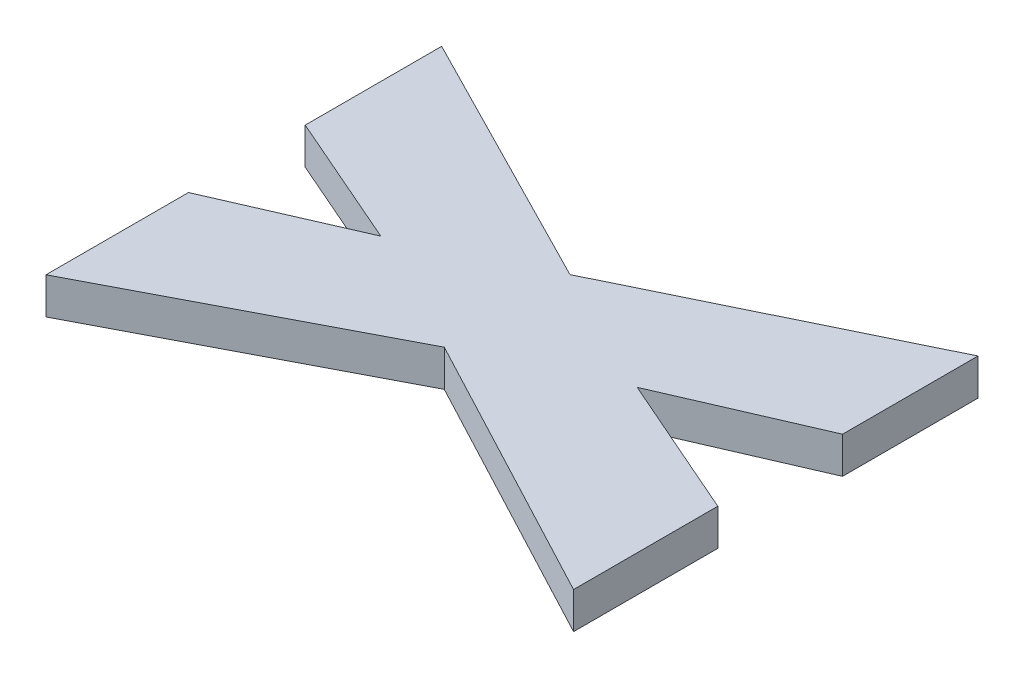
ISO-10303-21;
HEADER;
FILE_DESCRIPTION(('STEP AP214'),'2;1');
FILE_NAME('part.step','',(''),(''),'','','');
FILE_SCHEMA(('AUTOMOTIVE_DESIGN { 1 0 10303 214 1 1 1 1 }'));
ENDSEC;
DATA;
#1=APPLICATION_CONTEXT('core data for automotive mechanical design processes');
#2=APPLICATION_PROTOCOL_DEFINITION('international standard','automotive_design',2000,#1);
#3=PRODUCT_CONTEXT('',#1,'mechanical');
#4=PRODUCT('Part','Part','',(#3));
#5=PRODUCT_RELATED_PRODUCT_CATEGORY('part','',(#4));
#6=PRODUCT_DEFINITION_FORMATION('','',#4);
#7=PRODUCT_DEFINITION_CONTEXT('part definition',#1,'design');
#8=PRODUCT_DEFINITION('design','',#6,#7);
#9=PRODUCT_DEFINITION_SHAPE('','',#8);
#10=(LENGTH_UNIT() NAMED_UNIT(*) SI_UNIT(.MILLI.,.METRE.));
#11=(NAMED_UNIT(*) PLANE_ANGLE_UNIT() SI_UNIT($,.RADIAN.));
#12=(NAMED_UNIT(*) SI_UNIT($,.STERADIAN.) SOLID_ANGLE_UNIT());
#13=UNCERTAINTY_MEASURE_WITH_UNIT(LENGTH_MEASURE(1.E-05),#10,'distance_accuracy_value','');
#14=(GEOMETRIC_REPRESENTATION_CONTEXT(3) GLOBAL_UNCERTAINTY_ASSIGNED_CONTEXT((#13)) GLOBAL_UNIT_ASSIGNED_CONTEXT((#10,
#11,#12)) REPRESENTATION_CONTEXT('',''));
#15=CARTESIAN_POINT('',(0.,0.,0.));
#16=DIRECTION('',(0.,0.,1.));
#17=DIRECTION('',(1.,0.,0.));
#18=AXIS2_PLACEMENT_3D('',#15,#16,#17);
#19=CARTESIAN_POINT('',(2.3542541336,2.9906,-0.427267826055641));
#20=DIRECTION('',(1.,0.,0.));
#21=DIRECTION('',(0.,-1.,0.));
#22=AXIS2_PLACEMENT_3D('',#19,#20,#21);
#23=PLANE('',#22);
#24=DIRECTION('',(0.,0.,1.));
#25=VECTOR('',#24,1.);
#26=CARTESIAN_POINT('',(2.3542541336,2.9306,-0.427267826055641));
#27=LINE('',#26,#25);
#28=CARTESIAN_POINT('',(2.3542541336,2.9306,-0.427267826055641));
#29=VERTEX_POINT('',#28);
#30=CARTESIAN_POINT('',(2.3542541336,2.9306,-0.190288659388974));
#31=VERTEX_POINT('',#30);
#32=EDGE_CURVE('E11',#29,#31,#27,.T.);
#33=ORIENTED_EDGE('',*,*,#32,.F.);
#34=DIRECTION('',(0.,-1.,0.));
#35=VECTOR('',#34,1.);
#36=CARTESIAN_POINT('',(2.3542541336,2.9906,-0.427267826055641));
#37=LINE('',#36,#35);
#38=CARTESIAN_POINT('',(2.3542541336,2.9906,-0.427267826055641));
#39=VERTEX_POINT('',#38);
#40=EDGE_CURVE('E24',#39,#29,#37,.T.);
#41=ORIENTED_EDGE('',*,*,#40,.F.);
#42=DIRECTION('',(0.,0.,1.));
#43=VECTOR('',#42,1.);
#44=CARTESIAN_POINT('',(2.3542541336,2.9906,-0.427267826055641));
#45=LINE('',#44,#43);
#46=CARTESIAN_POINT('',(2.3542541336,2.9906,-0.190288659388974));
#47=VERTEX_POINT('',#46);
#48=EDGE_CURVE('E209',#39,#47,#45,.T.);
#49=ORIENTED_EDGE('',*,*,#48,.T.);
#50=DIRECTION('',(0.,-1.,0.));
#51=VECTOR('',#50,1.);
#52=CARTESIAN_POINT('',(2.3542541336,2.9906,-0.190288659388974));
#53=LINE('',#52,#51);
#54=EDGE_CURVE('E126',#47,#31,#53,.T.);
#55=ORIENTED_EDGE('',*,*,#54,.T.);
#56=EDGE_LOOP('',(#33,#41,#49,#55));
#57=FACE_BOUND('',#56,.T.);
#58=ADVANCED_FACE('F17',(#57),#23,.T.);
#59=CARTESIAN_POINT('',(2.1188548280444,2.9906,-0.530184492722307));
#60=DIRECTION('',(0.400588399484822,0.,-0.91625811548831));
#61=DIRECTION('',(-0.91625811548831,0.,-0.400588399484822));
#62=AXIS2_PLACEMENT_3D('',#59,#60,#61);
#63=PLANE('',#62);
#64=DIRECTION('',(0.91625811548831,0.,0.400588399484822));
#65=VECTOR('',#64,1.);
#66=CARTESIAN_POINT('',(2.1188548280444,2.9306,-0.530184492722307));
#67=LINE('',#66,#65);
#68=CARTESIAN_POINT('',(2.1188548280444,2.9306,-0.530184492722307));
#69=VERTEX_POINT('',#68);
#70=EDGE_CURVE('E206',#69,#29,#67,.T.);
#71=ORIENTED_EDGE('',*,*,#70,.F.);
#72=DIRECTION('',(0.,-1.,0.));
#73=VECTOR('',#72,1.);
#74=CARTESIAN_POINT('',(2.1188548280444,2.9906,-0.530184492722307));
#75=LINE('',#74,#73);
#76=CARTESIAN_POINT('',(2.1188548280444,2.9906,-0.530184492722307));
#77=VERTEX_POINT('',#76);
#78=EDGE_CURVE('E203',#77,#69,#75,.T.);
#79=ORIENTED_EDGE('',*,*,#78,.F.);
#80=DIRECTION('',(0.91625811548831,0.,0.400588399484822));
#81=VECTOR('',#80,1.);
#82=CARTESIAN_POINT('',(2.1188548280444,2.9906,-0.530184492722307));
#83=LINE('',#82,#81);
#84=EDGE_CURVE('E200',#77,#39,#83,.T.);
#85=ORIENTED_EDGE('',*,*,#84,.T.);
#86=ORIENTED_EDGE('',*,*,#40,.T.);
#87=EDGE_LOOP('',(#71,#79,#85,#86));
#88=FACE_BOUND('',#87,.T.);
#89=ADVANCED_FACE('F211',(#88),#63,.T.);
#90=CARTESIAN_POINT('',(2.3542541336,2.9906,-0.632198381611196));
#91=DIRECTION('',(0.397632125528502,0.,0.917544926827938));
#92=DIRECTION('',(0.917544926827938,0.,-0.397632125528502));
#93=AXIS2_PLACEMENT_3D('',#90,#91,#92);
#94=PLANE('',#93);
#95=DIRECTION('',(-0.917544926827938,0.,0.397632125528502));
#96=VECTOR('',#95,1.);
#97=CARTESIAN_POINT('',(2.3542541336,2.9306,-0.632198381611196));
#98=LINE('',#97,#96);
#99=CARTESIAN_POINT('',(2.3542541336,2.9306,-0.632198381611196));
#100=VERTEX_POINT('',#99);
#101=EDGE_CURVE('E197',#100,#69,#98,.T.);
#102=ORIENTED_EDGE('',*,*,#101,.F.);
#103=DIRECTION('',(0.,-1.,0.));
#104=VECTOR('',#103,1.);
#105=CARTESIAN_POINT('',(2.3542541336,2.9906,-0.632198381611196));
#106=LINE('',#105,#104);
#107=CARTESIAN_POINT('',(2.3542541336,2.9906,-0.632198381611196));
#108=VERTEX_POINT('',#107);
#109=EDGE_CURVE('E194',#108,#100,#106,.T.);
#110=ORIENTED_EDGE('',*,*,#109,.F.);
#111=DIRECTION('',(-0.917544926827938,0.,0.397632125528502));
#112=VECTOR('',#111,1.);
#113=CARTESIAN_POINT('',(2.3542541336,2.9906,-0.632198381611196));
#114=LINE('',#113,#112);
#115=EDGE_CURVE('E191',#108,#77,#114,.T.);
#116=ORIENTED_EDGE('',*,*,#115,.T.);
#117=ORIENTED_EDGE('',*,*,#78,.T.);
#118=EDGE_LOOP('',(#102,#110,#116,#117));
#119=FACE_BOUND('',#118,.T.);
#120=ADVANCED_FACE('F215',(#119),#94,.T.);
#121=CARTESIAN_POINT('',(2.3542541336,2.9906,-0.854733103833419));
#122=DIRECTION('',(1.,0.,0.));
#123=DIRECTION('',(0.,-1.,0.));
#124=AXIS2_PLACEMENT_3D('',#121,#122,#123);
#125=PLANE('',#124);
#126=DIRECTION('',(0.,0.,1.));
#127=VECTOR('',#126,1.);
#128=CARTESIAN_POINT('',(2.3542541336,2.9306,-0.854733103833419));
#129=LINE('',#128,#127);
#130=CARTESIAN_POINT('',(2.3542541336,2.9306,-0.854733103833419));
#131=VERTEX_POINT('',#130);
#132=EDGE_CURVE('E188',#131,#100,#129,.T.);
#133=ORIENTED_EDGE('',*,*,#132,.F.);
#134=DIRECTION('',(0.,-1.,0.));
#135=VECTOR('',#134,1.);
#136=CARTESIAN_POINT('',(2.3542541336,2.9906,-0.854733103833419));
#137=LINE('',#136,#135);
#138=CARTESIAN_POINT('',(2.3542541336,2.9906,-0.854733103833419));
#139=VERTEX_POINT('',#138);
#140=EDGE_CURVE('E185',#139,#131,#137,.T.);
#141=ORIENTED_EDGE('',*,*,#140,.F.);
#142=DIRECTION('',(0.,0.,1.));
#143=VECTOR('',#142,1.);
#144=CARTESIAN_POINT('',(2.3542541336,2.9906,-0.854733103833419));
#145=LINE('',#144,#143);
#146=EDGE_CURVE('E182',#139,#108,#145,.T.);
#147=ORIENTED_EDGE('',*,*,#146,.T.);
#148=ORIENTED_EDGE('',*,*,#109,.T.);
#149=EDGE_LOOP('',(#133,#141,#147,#148));
#150=FACE_BOUND('',#149,.T.);
#151=ADVANCED_FACE('F218',(#150),#125,.T.);
#152=CARTESIAN_POINT('',(1.9033166336,2.9906,-0.635358103833419));
#153=DIRECTION('',(-0.437465718849306,0.,-0.899235088745796));
#154=DIRECTION('',(-0.899235088745796,0.,0.437465718849306));
#155=AXIS2_PLACEMENT_3D('',#152,#153,#154);
#156=PLANE('',#155);
#157=DIRECTION('',(0.899235088745796,0.,-0.437465718849306));
#158=VECTOR('',#157,1.);
#159=CARTESIAN_POINT('',(1.9033166336,2.9306,-0.635358103833419));
#160=LINE('',#159,#158);
#161=CARTESIAN_POINT('',(1.9033166336,2.9306,-0.635358103833419));
#162=VERTEX_POINT('',#161);
#163=EDGE_CURVE('E179',#162,#131,#160,.T.);
#164=ORIENTED_EDGE('',*,*,#163,.F.);
#165=DIRECTION('',(0.,-1.,0.));
#166=VECTOR('',#165,1.);
#167=CARTESIAN_POINT('',(1.9033166336,2.9906,-0.635358103833419));
#168=LINE('',#167,#166);
#169=CARTESIAN_POINT('',(1.9033166336,2.9906,-0.635358103833419));
#170=VERTEX_POINT('',#169);
#171=EDGE_CURVE('E176',#170,#162,#168,.T.);
#172=ORIENTED_EDGE('',*,*,#171,.F.);
#173=DIRECTION('',(0.899235088745796,0.,-0.437465718849306));
#174=VECTOR('',#173,1.);
#175=CARTESIAN_POINT('',(1.9033166336,2.9906,-0.635358103833419));
#176=LINE('',#175,#174);
#177=EDGE_CURVE('E173',#170,#139,#176,.T.);
#178=ORIENTED_EDGE('',*,*,#177,.T.);
#179=ORIENTED_EDGE('',*,*,#140,.T.);
#180=EDGE_LOOP('',(#164,#172,#178,#179));
#181=FACE_BOUND('',#180,.T.);
#182=ADVANCED_FACE('F223',(#181),#156,.T.);
#183=CARTESIAN_POINT('',(1.4731430224888,2.9906,-0.854733103833419));
#184=DIRECTION('',(0.454303827717206,0.,-0.890846806202669));
#185=DIRECTION('',(-0.890846806202669,0.,-0.454303827717206));
#186=AXIS2_PLACEMENT_3D('',#183,#184,#185);
#187=PLANE('',#186);
#188=DIRECTION('',(0.890846806202669,0.,0.454303827717206));
#189=VECTOR('',#188,1.);
#190=CARTESIAN_POINT('',(1.4731430224888,2.9306,-0.854733103833419));
#191=LINE('',#190,#189);
#192=CARTESIAN_POINT('',(1.4731430224888,2.9306,-0.854733103833419));
#193=VERTEX_POINT('',#192);
#194=EDGE_CURVE('E170',#193,#162,#191,.T.);
#195=ORIENTED_EDGE('',*,*,#194,.F.);
#196=DIRECTION('',(0.,-1.,0.));
#197=VECTOR('',#196,1.);
#198=CARTESIAN_POINT('',(1.4731430224888,2.9906,-0.854733103833419));
#199=LINE('',#198,#197);
#200=CARTESIAN_POINT('',(1.4731430224888,2.9906,-0.854733103833419));
#201=VERTEX_POINT('',#200);
#202=EDGE_CURVE('E167',#201,#193,#199,.T.);
#203=ORIENTED_EDGE('',*,*,#202,.F.);
#204=DIRECTION('',(0.890846806202669,0.,0.454303827717206));
#205=VECTOR('',#204,1.);
#206=CARTESIAN_POINT('',(1.4731430224888,2.9906,-0.854733103833419));
#207=LINE('',#206,#205);
#208=EDGE_CURVE('E164',#201,#170,#207,.T.);
#209=ORIENTED_EDGE('',*,*,#208,.T.);
#210=ORIENTED_EDGE('',*,*,#171,.T.);
#211=EDGE_LOOP('',(#195,#203,#209,#210));
#212=FACE_BOUND('',#211,.T.);
#213=ADVANCED_FACE('F225',(#212),#187,.T.);
#214=CARTESIAN_POINT('',(1.4731430224888,2.9906,-0.630618520500085));
#215=DIRECTION('',(-1.,0.,0.));
#216=DIRECTION('',(0.,1.,0.));
#217=AXIS2_PLACEMENT_3D('',#214,#215,#216);
#218=PLANE('',#217);
#219=DIRECTION('',(0.,0.,-1.));
#220=VECTOR('',#219,1.);
#221=CARTESIAN_POINT('',(1.4731430224888,2.9306,-0.630618520500085));
#222=LINE('',#221,#220);
#223=CARTESIAN_POINT('',(1.4731430224888,2.9306,-0.630618520500085));
#224=VERTEX_POINT('',#223);
#225=EDGE_CURVE('E161',#224,#193,#222,.T.);
#226=ORIENTED_EDGE('',*,*,#225,.F.);
#227=DIRECTION('',(0.,-1.,0.));
#228=VECTOR('',#227,1.);
#229=CARTESIAN_POINT('',(1.4731430224888,2.9906,-0.630618520500085));
#230=LINE('',#229,#228);
#231=CARTESIAN_POINT('',(1.4731430224888,2.9906,-0.630618520500085));
#232=VERTEX_POINT('',#231);
#233=EDGE_CURVE('E158',#232,#224,#230,.T.);
#234=ORIENTED_EDGE('',*,*,#233,.F.);
#235=DIRECTION('',(0.,0.,-1.));
#236=VECTOR('',#235,1.);
#237=CARTESIAN_POINT('',(1.4731430224888,2.9906,-0.630618520500085));
#238=LINE('',#237,#236);
#239=EDGE_CURVE('E155',#232,#201,#238,.T.);
#240=ORIENTED_EDGE('',*,*,#239,.T.);
#241=ORIENTED_EDGE('',*,*,#202,.T.);
#242=EDGE_LOOP('',(#226,#234,#240,#241));
#243=FACE_BOUND('',#242,.T.);
#244=ADVANCED_FACE('F227',(#243),#218,.T.);
#245=CARTESIAN_POINT('',(1.6931951058222,2.9906,-0.534698381611196));
#246=DIRECTION('',(-0.399585420513928,0.,0.916695964708424));
#247=DIRECTION('',(0.916695964708424,0.,0.399585420513928));
#248=AXIS2_PLACEMENT_3D('',#245,#246,#247);
#249=PLANE('',#248);
#250=DIRECTION('',(-0.916695964708424,0.,-0.399585420513928));
#251=VECTOR('',#250,1.);
#252=CARTESIAN_POINT('',(1.6931951058222,2.9306,-0.534698381611196));
#253=LINE('',#252,#251);
#254=CARTESIAN_POINT('',(1.6931951058222,2.9306,-0.534698381611196));
#255=VERTEX_POINT('',#254);
#256=EDGE_CURVE('E152',#255,#224,#253,.T.);
#257=ORIENTED_EDGE('',*,*,#256,.F.);
#258=DIRECTION('',(0.,-1.,0.));
#259=VECTOR('',#258,1.);
#260=CARTESIAN_POINT('',(1.6931951058222,2.9906,-0.534698381611196));
#261=LINE('',#260,#259);
#262=CARTESIAN_POINT('',(1.6931951058222,2.9906,-0.534698381611196));
#263=VERTEX_POINT('',#262);
#264=EDGE_CURVE('E149',#263,#255,#261,.T.);
#265=ORIENTED_EDGE('',*,*,#264,.F.);
#266=DIRECTION('',(-0.916695964708424,0.,-0.399585420513928));
#267=VECTOR('',#266,1.);
#268=CARTESIAN_POINT('',(1.6931951058222,2.9906,-0.534698381611196));
#269=LINE('',#268,#267);
#270=EDGE_CURVE('E146',#263,#232,#269,.T.);
#271=ORIENTED_EDGE('',*,*,#270,.T.);
#272=ORIENTED_EDGE('',*,*,#233,.T.);
#273=EDGE_LOOP('',(#257,#265,#271,#272));
#274=FACE_BOUND('',#273,.T.);
#275=ADVANCED_FACE('F230',(#274),#249,.T.);
#276=CARTESIAN_POINT('',(1.4731430224888,2.9906,-0.438778242722307));
#277=DIRECTION('',(-0.399585420513928,0.,-0.916695964708424));
#278=DIRECTION('',(-0.916695964708424,0.,0.399585420513928));
#279=AXIS2_PLACEMENT_3D('',#276,#277,#278);
#280=PLANE('',#279);
#281=DIRECTION('',(0.916695964708423,0.,-0.399585420513928));
#282=VECTOR('',#281,1.);
#283=CARTESIAN_POINT('',(1.4731430224888,2.9306,-0.438778242722307));
#284=LINE('',#283,#282);
#285=CARTESIAN_POINT('',(1.4731430224888,2.9306,-0.438778242722307));
#286=VERTEX_POINT('',#285);
#287=EDGE_CURVE('E143',#286,#255,#284,.T.);
#288=ORIENTED_EDGE('',*,*,#287,.F.);
#289=DIRECTION('',(0.,-1.,0.));
#290=VECTOR('',#289,1.);
#291=CARTESIAN_POINT('',(1.4731430224888,2.9906,-0.438778242722307));
#292=LINE('',#291,#290);
#293=CARTESIAN_POINT('',(1.4731430224888,2.9906,-0.438778242722307));
#294=VERTEX_POINT('',#293);
#295=EDGE_CURVE('E140',#294,#286,#292,.T.);
#296=ORIENTED_EDGE('',*,*,#295,.F.);
#297=DIRECTION('',(0.916695964708423,0.,-0.399585420513928));
#298=VECTOR('',#297,1.);
#299=CARTESIAN_POINT('',(1.4731430224888,2.9906,-0.438778242722307));
#300=LINE('',#299,#298);
#301=EDGE_CURVE('E137',#294,#263,#300,.T.);
#302=ORIENTED_EDGE('',*,*,#301,.T.);
#303=ORIENTED_EDGE('',*,*,#264,.T.);
#304=EDGE_LOOP('',(#288,#296,#302,#303));
#305=FACE_BOUND('',#304,.T.);
#306=ADVANCED_FACE('F233',(#305),#280,.T.);
#307=CARTESIAN_POINT('',(1.4731430224888,2.9906,-0.204733103833419));
#308=DIRECTION('',(-1.,0.,0.));
#309=DIRECTION('',(0.,1.,0.));
#310=AXIS2_PLACEMENT_3D('',#307,#308,#309);
#311=PLANE('',#310);
#312=DIRECTION('',(0.,0.,-1.));
#313=VECTOR('',#312,1.);
#314=CARTESIAN_POINT('',(1.4731430224888,2.9306,-0.204733103833419));
#315=LINE('',#314,#313);
#316=CARTESIAN_POINT('',(1.4731430224888,2.9306,-0.204733103833419));
#317=VERTEX_POINT('',#316);
#318=EDGE_CURVE('E134',#317,#286,#315,.T.);
#319=ORIENTED_EDGE('',*,*,#318,.F.);
#320=DIRECTION('',(0.,-1.,0.));
#321=VECTOR('',#320,1.);
#322=CARTESIAN_POINT('',(1.4731430224888,2.9906,-0.204733103833419));
#323=LINE('',#322,#321);
#324=CARTESIAN_POINT('',(1.4731430224888,2.9906,-0.204733103833419));
#325=VERTEX_POINT('',#324);
#326=EDGE_CURVE('E132',#325,#317,#323,.T.);
#327=ORIENTED_EDGE('',*,*,#326,.F.);
#328=DIRECTION('',(0.,0.,-1.));
#329=VECTOR('',#328,1.);
#330=CARTESIAN_POINT('',(1.4731430224888,2.9906,-0.204733103833419));
#331=LINE('',#330,#329);
#332=EDGE_CURVE('E121',#325,#294,#331,.T.);
#333=ORIENTED_EDGE('',*,*,#332,.T.);
#334=ORIENTED_EDGE('',*,*,#295,.T.);
#335=EDGE_LOOP('',(#319,#327,#333,#334));
#336=FACE_BOUND('',#335,.T.);
#337=ADVANCED_FACE('F235',(#336),#311,.T.);
#338=CARTESIAN_POINT('',(1.9033166336,2.9906,-0.428847687166752));
#339=DIRECTION('',(0.46204116879513,0.,0.886858477062959));
#340=DIRECTION('',(0.886858477062959,0.,-0.46204116879513));
#341=AXIS2_PLACEMENT_3D('',#338,#339,#340);
#342=PLANE('',#341);
#343=DIRECTION('',(-0.886858477062959,0.,0.46204116879513));
#344=VECTOR('',#343,1.);
#345=CARTESIAN_POINT('',(1.9033166336,2.9306,-0.428847687166752));
#346=LINE('',#345,#344);
#347=CARTESIAN_POINT('',(1.9033166336,2.9306,-0.428847687166752));
#348=VERTEX_POINT('',#347);
#349=EDGE_CURVE('E108',#348,#317,#346,.T.);
#350=ORIENTED_EDGE('',*,*,#349,.F.);
#351=DIRECTION('',(0.,-1.,0.));
#352=VECTOR('',#351,1.);
#353=CARTESIAN_POINT('',(1.9033166336,2.9906,-0.428847687166752));
#354=LINE('',#353,#352);
#355=CARTESIAN_POINT('',(1.9033166336,2.9906,-0.428847687166752));
#356=VERTEX_POINT('',#355);
#357=EDGE_CURVE('E102',#356,#348,#354,.T.);
#358=ORIENTED_EDGE('',*,*,#357,.F.);
#359=DIRECTION('',(-0.886858477062959,0.,0.46204116879513));
#360=VECTOR('',#359,1.);
#361=CARTESIAN_POINT('',(1.9033166336,2.9906,-0.428847687166752));
#362=LINE('',#361,#360);
#363=EDGE_CURVE('E106',#356,#325,#362,.T.);
#364=ORIENTED_EDGE('',*,*,#363,.T.);
#365=ORIENTED_EDGE('',*,*,#326,.T.);
#366=EDGE_LOOP('',(#350,#358,#364,#365));
#367=FACE_BOUND('',#366,.T.);
#368=ADVANCED_FACE('F104',(#367),#342,.T.);
#369=CARTESIAN_POINT('',(2.3542541336,2.9906,-0.190288659388974));
#370=DIRECTION('',(-0.467623451421972,0.,0.883927772886565));
#371=DIRECTION('',(0.883927772886565,0.,0.467623451421972));
#372=AXIS2_PLACEMENT_3D('',#369,#370,#371);
#373=PLANE('',#372);
#374=DIRECTION('',(-0.883927772886565,0.,-0.467623451421972));
#375=VECTOR('',#374,1.);
#376=CARTESIAN_POINT('',(2.3542541336,2.9306,-0.190288659388974));
#377=LINE('',#376,#375);
#378=EDGE_CURVE('E122',#31,#348,#377,.T.);
#379=ORIENTED_EDGE('',*,*,#378,.F.);
#380=ORIENTED_EDGE('',*,*,#54,.F.);
#381=DIRECTION('',(-0.883927772886565,0.,-0.467623451421972));
#382=VECTOR('',#381,1.);
#383=CARTESIAN_POINT('',(2.3542541336,2.9906,-0.190288659388974));
#384=LINE('',#383,#382);
#385=EDGE_CURVE('E118',#47,#356,#384,.T.);
#386=ORIENTED_EDGE('',*,*,#385,.T.);
#387=ORIENTED_EDGE('',*,*,#357,.T.);
#388=EDGE_LOOP('',(#379,#380,#386,#387));
#389=FACE_BOUND('',#388,.T.);
#390=ADVANCED_FACE('F125',(#389),#373,.T.);
#391=CARTESIAN_POINT('',(0.,2.9906,0.));
#392=DIRECTION('',(0.,-1.,0.));
#393=DIRECTION('',(-1.,0.,0.));
#394=AXIS2_PLACEMENT_3D('',#391,#392,#393);
#395=PLANE('',#394);
#396=ORIENTED_EDGE('',*,*,#48,.F.);
#397=ORIENTED_EDGE('',*,*,#84,.F.);
#398=ORIENTED_EDGE('',*,*,#115,.F.);
#399=ORIENTED_EDGE('',*,*,#146,.F.);
#400=ORIENTED_EDGE('',*,*,#177,.F.);
#401=ORIENTED_EDGE('',*,*,#208,.F.);
#402=ORIENTED_EDGE('',*,*,#239,.F.);
#403=ORIENTED_EDGE('',*,*,#270,.F.);
#404=ORIENTED_EDGE('',*,*,#301,.F.);
#405=ORIENTED_EDGE('',*,*,#332,.F.);
#406=ORIENTED_EDGE('',*,*,#363,.F.);
#407=ORIENTED_EDGE('',*,*,#385,.F.);
#408=EDGE_LOOP('',(#396,#397,#398,#399,#400,#401,#402,#403,#404,#405,#406,#407));
#409=FACE_BOUND('',#408,.T.);
#410=ADVANCED_FACE('F117',(#409),#395,.F.);
#411=CARTESIAN_POINT('',(0.,2.9306,0.));
#412=DIRECTION('',(0.,-1.,0.));
#413=DIRECTION('',(-1.,0.,0.));
#414=AXIS2_PLACEMENT_3D('',#411,#412,#413);
#415=PLANE('',#414);
#416=ORIENTED_EDGE('',*,*,#32,.T.);
#417=ORIENTED_EDGE('',*,*,#378,.T.);
#418=ORIENTED_EDGE('',*,*,#349,.T.);
#419=ORIENTED_EDGE('',*,*,#318,.T.);
#420=ORIENTED_EDGE('',*,*,#287,.T.);
#421=ORIENTED_EDGE('',*,*,#256,.T.);
#422=ORIENTED_EDGE('',*,*,#225,.T.);
#423=ORIENTED_EDGE('',*,*,#194,.T.);
#424=ORIENTED_EDGE('',*,*,#163,.T.);
#425=ORIENTED_EDGE('',*,*,#132,.T.);
#426=ORIENTED_EDGE('',*,*,#101,.T.);
#427=ORIENTED_EDGE('',*,*,#70,.T.);
#428=EDGE_LOOP('',(#416,#417,#418,#419,#420,#421,#422,#423,#424,#425,#426,#427));
#429=FACE_BOUND('',#428,.T.);
#430=ADVANCED_FACE('F213',(#429),#415,.T.);
#431=CLOSED_SHELL('',(#58,#89,#120,#151,#182,#213,#244,#275,#306,#337,#368,#390,#410,#430));
#432=MANIFOLD_SOLID_BREP('B1',#431);
#433=ADVANCED_BREP_SHAPE_REPRESENTATION('',(#18,#432),#14);
#434=SHAPE_DEFINITION_REPRESENTATION(#9,#433);
ENDSEC;
END-ISO-10303-21;
